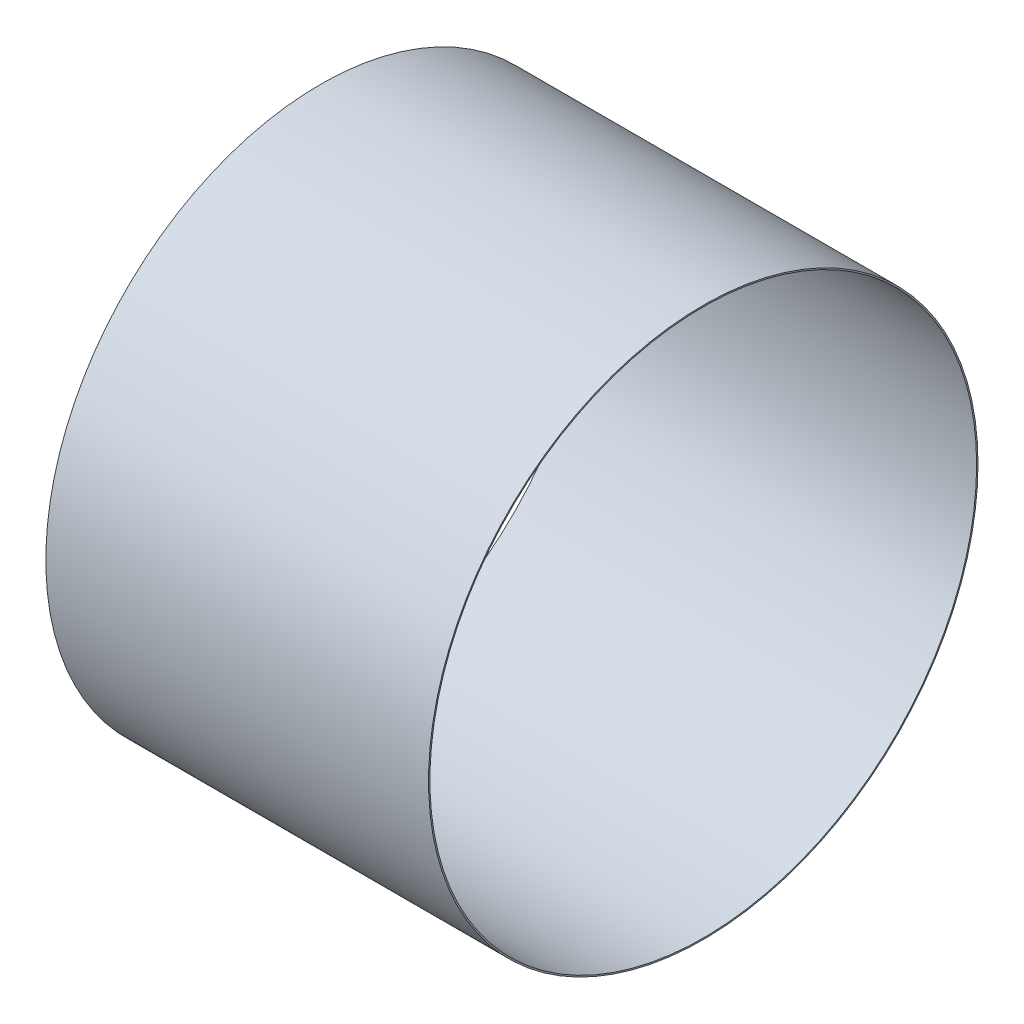
ISO-10303-21;
HEADER;
FILE_DESCRIPTION(('STEP AP214'),'2;1');
FILE_NAME('part.step','',(''),(''),'','','');
FILE_SCHEMA(('AUTOMOTIVE_DESIGN { 1 0 10303 214 1 1 1 1 }'));
ENDSEC;
DATA;
#1=APPLICATION_CONTEXT('core data for automotive mechanical design processes');
#2=APPLICATION_PROTOCOL_DEFINITION('international standard','automotive_design',2000,#1);
#3=PRODUCT_CONTEXT('',#1,'mechanical');
#4=PRODUCT('Part','Part','',(#3));
#5=PRODUCT_RELATED_PRODUCT_CATEGORY('part','',(#4));
#6=PRODUCT_DEFINITION_FORMATION('','',#4);
#7=PRODUCT_DEFINITION_CONTEXT('part definition',#1,'design');
#8=PRODUCT_DEFINITION('design','',#6,#7);
#9=PRODUCT_DEFINITION_SHAPE('','',#8);
#10=(LENGTH_UNIT() NAMED_UNIT(*) SI_UNIT(.MILLI.,.METRE.));
#11=(NAMED_UNIT(*) PLANE_ANGLE_UNIT() SI_UNIT($,.RADIAN.));
#12=(NAMED_UNIT(*) SI_UNIT($,.STERADIAN.) SOLID_ANGLE_UNIT());
#13=UNCERTAINTY_MEASURE_WITH_UNIT(LENGTH_MEASURE(1.E-05),#10,'distance_accuracy_value','');
#14=(GEOMETRIC_REPRESENTATION_CONTEXT(3) GLOBAL_UNCERTAINTY_ASSIGNED_CONTEXT((#13)) GLOBAL_UNIT_ASSIGNED_CONTEXT((#10,
#11,#12)) REPRESENTATION_CONTEXT('',''));
#15=CARTESIAN_POINT('',(0.,0.,0.));
#16=DIRECTION('',(0.,0.,1.));
#17=DIRECTION('',(1.,0.,0.));
#18=AXIS2_PLACEMENT_3D('',#15,#16,#17);
#19=CARTESIAN_POINT('',(889.,0.,0.));
#20=DIRECTION('',(1.,0.,0.));
#21=DIRECTION('',(0.,0.,-1.));
#22=AXIS2_PLACEMENT_3D('',#19,#20,#21);
#23=PLANE('',#22);
#24=CARTESIAN_POINT('',(889.,0.,0.));
#25=DIRECTION('',(1.,0.,0.));
#26=DIRECTION('',(0.,0.,-1.));
#27=AXIS2_PLACEMENT_3D('',#24,#25,#26);
#28=CIRCLE('',#27,638.175);
#29=CARTESIAN_POINT('',(889.,0.,-638.175));
#30=VERTEX_POINT('',#29);
#31=EDGE_CURVE('E11',#30,#30,#28,.T.);
#32=ORIENTED_EDGE('',*,*,#31,.T.);
#33=EDGE_LOOP('',(#32));
#34=FACE_BOUND('',#33,.T.);
#35=CARTESIAN_POINT('',(889.,0.,0.));
#36=DIRECTION('',(1.,0.,0.));
#37=DIRECTION('',(0.,0.,-1.));
#38=AXIS2_PLACEMENT_3D('',#35,#36,#37);
#39=CIRCLE('',#38,635.);
#40=CARTESIAN_POINT('',(889.,0.,-635.));
#41=VERTEX_POINT('',#40);
#42=EDGE_CURVE('E48',#41,#41,#39,.T.);
#43=ORIENTED_EDGE('',*,*,#42,.F.);
#44=EDGE_LOOP('',(#43));
#45=FACE_BOUND('',#44,.T.);
#46=ADVANCED_FACE('F37',(#34,#45),#23,.T.);
#47=CARTESIAN_POINT('',(0.,0.,0.));
#48=DIRECTION('',(1.,0.,0.));
#49=DIRECTION('',(0.,0.,-1.));
#50=AXIS2_PLACEMENT_3D('',#47,#48,#49);
#51=PLANE('',#50);
#52=CARTESIAN_POINT('',(0.,0.,0.));
#53=DIRECTION('',(1.,0.,0.));
#54=DIRECTION('',(0.,0.,-1.));
#55=AXIS2_PLACEMENT_3D('',#52,#53,#54);
#56=CIRCLE('',#55,638.175);
#57=CARTESIAN_POINT('',(0.,0.,-638.175));
#58=VERTEX_POINT('',#57);
#59=EDGE_CURVE('E41',#58,#58,#56,.T.);
#60=ORIENTED_EDGE('',*,*,#59,.F.);
#61=EDGE_LOOP('',(#60));
#62=FACE_BOUND('',#61,.T.);
#63=CARTESIAN_POINT('',(0.,0.,0.));
#64=DIRECTION('',(1.,0.,0.));
#65=DIRECTION('',(0.,0.,-1.));
#66=AXIS2_PLACEMENT_3D('',#63,#64,#65);
#67=CIRCLE('',#66,635.);
#68=CARTESIAN_POINT('',(0.,0.,-635.));
#69=VERTEX_POINT('',#68);
#70=EDGE_CURVE('E50',#69,#69,#67,.T.);
#71=ORIENTED_EDGE('',*,*,#70,.T.);
#72=EDGE_LOOP('',(#71));
#73=FACE_BOUND('',#72,.T.);
#74=ADVANCED_FACE('F60',(#62,#73),#51,.F.);
#75=CARTESIAN_POINT('',(889.,0.,0.));
#76=DIRECTION('',(-1.,0.,0.));
#77=DIRECTION('',(0.,0.,1.));
#78=AXIS2_PLACEMENT_3D('',#75,#76,#77);
#79=CYLINDRICAL_SURFACE('',#78,638.175);
#80=ORIENTED_EDGE('',*,*,#31,.F.);
#81=EDGE_LOOP('',(#80));
#82=FACE_BOUND('',#81,.T.);
#83=ORIENTED_EDGE('',*,*,#59,.T.);
#84=EDGE_LOOP('',(#83));
#85=FACE_BOUND('',#84,.T.);
#86=ADVANCED_FACE('F39',(#82,#85),#79,.T.);
#87=CARTESIAN_POINT('',(889.,0.,0.));
#88=DIRECTION('',(-1.,0.,0.));
#89=DIRECTION('',(0.,0.,1.));
#90=AXIS2_PLACEMENT_3D('',#87,#88,#89);
#91=CYLINDRICAL_SURFACE('',#90,635.);
#92=ORIENTED_EDGE('',*,*,#42,.T.);
#93=EDGE_LOOP('',(#92));
#94=FACE_BOUND('',#93,.T.);
#95=ORIENTED_EDGE('',*,*,#70,.F.);
#96=EDGE_LOOP('',(#95));
#97=FACE_BOUND('',#96,.T.);
#98=ADVANCED_FACE('F56',(#94,#97),#91,.F.);
#99=CLOSED_SHELL('',(#46,#74,#86,#98));
#100=MANIFOLD_SOLID_BREP('B2',#99);
#101=ADVANCED_BREP_SHAPE_REPRESENTATION('',(#18,#100),#14);
#102=SHAPE_DEFINITION_REPRESENTATION(#9,#101);
ENDSEC;
END-ISO-10303-21;
